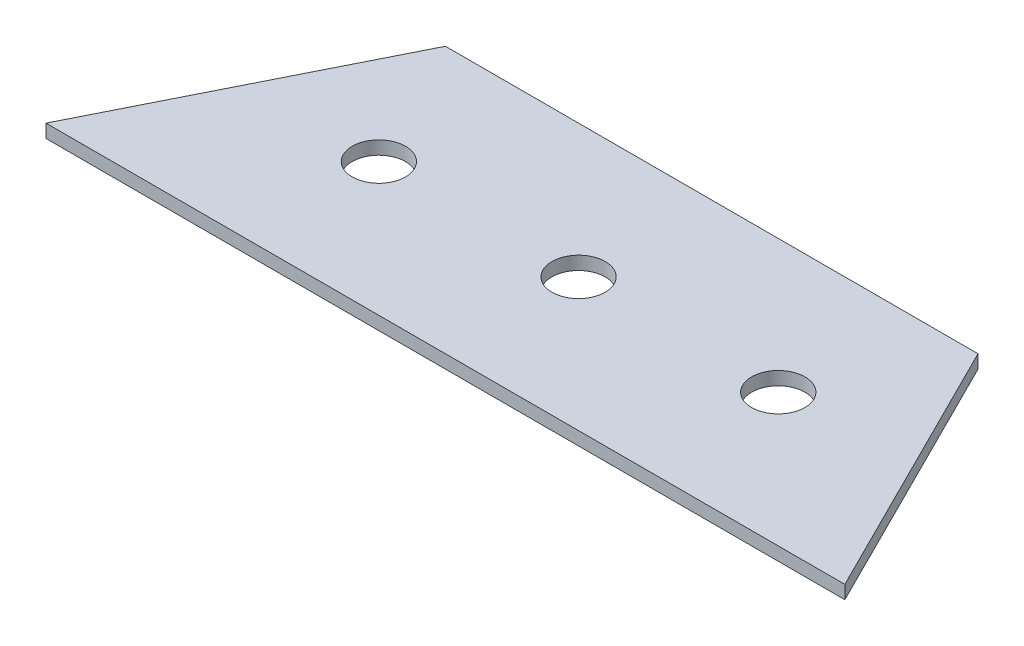
ISO-10303-21;
HEADER;
FILE_DESCRIPTION(('STEP AP214'),'2;1');
FILE_NAME('part.step','',(''),(''),'','','');
FILE_SCHEMA(('AUTOMOTIVE_DESIGN { 1 0 10303 214 1 1 1 1 }'));
ENDSEC;
DATA;
#1=APPLICATION_CONTEXT('core data for automotive mechanical design processes');
#2=APPLICATION_PROTOCOL_DEFINITION('international standard','automotive_design',2000,#1);
#3=PRODUCT_CONTEXT('',#1,'mechanical');
#4=PRODUCT('Part','Part','',(#3));
#5=PRODUCT_RELATED_PRODUCT_CATEGORY('part','',(#4));
#6=PRODUCT_DEFINITION_FORMATION('','',#4);
#7=PRODUCT_DEFINITION_CONTEXT('part definition',#1,'design');
#8=PRODUCT_DEFINITION('design','',#6,#7);
#9=PRODUCT_DEFINITION_SHAPE('','',#8);
#10=(LENGTH_UNIT() NAMED_UNIT(*) SI_UNIT(.MILLI.,.METRE.));
#11=(NAMED_UNIT(*) PLANE_ANGLE_UNIT() SI_UNIT($,.RADIAN.));
#12=(NAMED_UNIT(*) SI_UNIT($,.STERADIAN.) SOLID_ANGLE_UNIT());
#13=UNCERTAINTY_MEASURE_WITH_UNIT(LENGTH_MEASURE(1.E-05),#10,'distance_accuracy_value','');
#14=(GEOMETRIC_REPRESENTATION_CONTEXT(3) GLOBAL_UNCERTAINTY_ASSIGNED_CONTEXT((#13)) GLOBAL_UNIT_ASSIGNED_CONTEXT((#10,
#11,#12)) REPRESENTATION_CONTEXT('',''));
#15=CARTESIAN_POINT('',(0.,0.,0.));
#16=DIRECTION('',(0.,0.,1.));
#17=DIRECTION('',(1.,0.,0.));
#18=AXIS2_PLACEMENT_3D('',#15,#16,#17);
#19=CARTESIAN_POINT('',(-25.4,2.54,-50.8));
#20=DIRECTION('',(-0.894427190999916,0.,0.447213595499958));
#21=DIRECTION('',(0.447213595499958,0.,0.894427190999916));
#22=AXIS2_PLACEMENT_3D('',#19,#20,#21);
#23=PLANE('',#22);
#24=DIRECTION('',(-0.447213595499958,0.,-0.894427190999916));
#25=VECTOR('',#24,1.);
#26=CARTESIAN_POINT('',(-25.4,0.,-50.8));
#27=LINE('',#26,#25);
#28=CARTESIAN_POINT('',(0.,0.,0.));
#29=VERTEX_POINT('',#28);
#30=CARTESIAN_POINT('',(-25.4,0.,-50.8));
#31=VERTEX_POINT('',#30);
#32=EDGE_CURVE('E96',#29,#31,#27,.T.);
#33=ORIENTED_EDGE('',*,*,#32,.T.);
#34=DIRECTION('',(0.,-1.,0.));
#35=VECTOR('',#34,1.);
#36=CARTESIAN_POINT('',(-25.4,2.54,-50.8));
#37=LINE('',#36,#35);
#38=CARTESIAN_POINT('',(-25.4,2.54,-50.8));
#39=VERTEX_POINT('',#38);
#40=EDGE_CURVE('E11',#39,#31,#37,.T.);
#41=ORIENTED_EDGE('',*,*,#40,.F.);
#42=DIRECTION('',(-0.447213595499958,0.,-0.894427190999916));
#43=VECTOR('',#42,1.);
#44=CARTESIAN_POINT('',(-25.4,2.54,-50.8));
#45=LINE('',#44,#43);
#46=CARTESIAN_POINT('',(0.,2.54,0.));
#47=VERTEX_POINT('',#46);
#48=EDGE_CURVE('E84',#47,#39,#45,.T.);
#49=ORIENTED_EDGE('',*,*,#48,.F.);
#50=DIRECTION('',(0.,-1.,0.));
#51=VECTOR('',#50,1.);
#52=CARTESIAN_POINT('',(0.,2.54,0.));
#53=LINE('',#52,#51);
#54=EDGE_CURVE('E92',#47,#29,#53,.T.);
#55=ORIENTED_EDGE('',*,*,#54,.T.);
#56=EDGE_LOOP('',(#33,#41,#49,#55));
#57=FACE_BOUND('',#56,.T.);
#58=ADVANCED_FACE('F33',(#57),#23,.F.);
#59=CARTESIAN_POINT('',(-127.,2.54,-50.8));
#60=DIRECTION('',(0.,0.,1.));
#61=DIRECTION('',(1.,0.,0.));
#62=AXIS2_PLACEMENT_3D('',#59,#60,#61);
#63=PLANE('',#62);
#64=DIRECTION('',(-1.,0.,0.));
#65=VECTOR('',#64,1.);
#66=CARTESIAN_POINT('',(-127.,0.,-50.8));
#67=LINE('',#66,#65);
#68=CARTESIAN_POINT('',(-127.,0.,-50.8));
#69=VERTEX_POINT('',#68);
#70=EDGE_CURVE('E88',#31,#69,#67,.T.);
#71=ORIENTED_EDGE('',*,*,#70,.T.);
#72=DIRECTION('',(0.,-1.,0.));
#73=VECTOR('',#72,1.);
#74=CARTESIAN_POINT('',(-127.,2.54,-50.8));
#75=LINE('',#74,#73);
#76=CARTESIAN_POINT('',(-127.,2.54,-50.8));
#77=VERTEX_POINT('',#76);
#78=EDGE_CURVE('E41',#77,#69,#75,.T.);
#79=ORIENTED_EDGE('',*,*,#78,.F.);
#80=DIRECTION('',(-1.,0.,0.));
#81=VECTOR('',#80,1.);
#82=CARTESIAN_POINT('',(-127.,2.54,-50.8));
#83=LINE('',#82,#81);
#84=EDGE_CURVE('E79',#39,#77,#83,.T.);
#85=ORIENTED_EDGE('',*,*,#84,.F.);
#86=ORIENTED_EDGE('',*,*,#40,.T.);
#87=EDGE_LOOP('',(#71,#79,#85,#86));
#88=FACE_BOUND('',#87,.T.);
#89=ADVANCED_FACE('F87',(#88),#63,.F.);
#90=CARTESIAN_POINT('',(-152.4,2.54,0.));
#91=DIRECTION('',(0.894427190999916,0.,0.447213595499958));
#92=DIRECTION('',(0.447213595499958,0.,-0.894427190999916));
#93=AXIS2_PLACEMENT_3D('',#90,#91,#92);
#94=PLANE('',#93);
#95=DIRECTION('',(-0.447213595499958,0.,0.894427190999916));
#96=VECTOR('',#95,1.);
#97=CARTESIAN_POINT('',(-152.4,0.,0.));
#98=LINE('',#97,#96);
#99=CARTESIAN_POINT('',(-152.4,0.,0.));
#100=VERTEX_POINT('',#99);
#101=EDGE_CURVE('E66',#69,#100,#98,.T.);
#102=ORIENTED_EDGE('',*,*,#101,.T.);
#103=DIRECTION('',(0.,-1.,0.));
#104=VECTOR('',#103,1.);
#105=CARTESIAN_POINT('',(-152.4,2.54,0.));
#106=LINE('',#105,#104);
#107=CARTESIAN_POINT('',(-152.4,2.54,0.));
#108=VERTEX_POINT('',#107);
#109=EDGE_CURVE('E89',#108,#100,#106,.T.);
#110=ORIENTED_EDGE('',*,*,#109,.F.);
#111=DIRECTION('',(-0.447213595499958,0.,0.894427190999916));
#112=VECTOR('',#111,1.);
#113=CARTESIAN_POINT('',(-152.4,2.54,0.));
#114=LINE('',#113,#112);
#115=EDGE_CURVE('E82',#77,#108,#114,.T.);
#116=ORIENTED_EDGE('',*,*,#115,.F.);
#117=ORIENTED_EDGE('',*,*,#78,.T.);
#118=EDGE_LOOP('',(#102,#110,#116,#117));
#119=FACE_BOUND('',#118,.T.);
#120=ADVANCED_FACE('F90',(#119),#94,.F.);
#121=CARTESIAN_POINT('',(0.,2.54,0.));
#122=DIRECTION('',(0.,0.,-1.));
#123=DIRECTION('',(-1.,0.,0.));
#124=AXIS2_PLACEMENT_3D('',#121,#122,#123);
#125=PLANE('',#124);
#126=DIRECTION('',(1.,0.,0.));
#127=VECTOR('',#126,1.);
#128=CARTESIAN_POINT('',(0.,0.,0.));
#129=LINE('',#128,#127);
#130=EDGE_CURVE('E72',#100,#29,#129,.T.);
#131=ORIENTED_EDGE('',*,*,#130,.T.);
#132=ORIENTED_EDGE('',*,*,#54,.F.);
#133=DIRECTION('',(1.,0.,0.));
#134=VECTOR('',#133,1.);
#135=CARTESIAN_POINT('',(0.,2.54,0.));
#136=LINE('',#135,#134);
#137=EDGE_CURVE('E49',#108,#47,#136,.T.);
#138=ORIENTED_EDGE('',*,*,#137,.F.);
#139=ORIENTED_EDGE('',*,*,#109,.T.);
#140=EDGE_LOOP('',(#131,#132,#138,#139));
#141=FACE_BOUND('',#140,.T.);
#142=ADVANCED_FACE('F104',(#141),#125,.F.);
#143=CARTESIAN_POINT('',(0.,2.54,0.));
#144=DIRECTION('',(0.,-1.,0.));
#145=DIRECTION('',(0.,0.,-1.));
#146=AXIS2_PLACEMENT_3D('',#143,#144,#145);
#147=PLANE('',#146);
#148=CARTESIAN_POINT('',(-38.1,2.54,-25.4));
#149=DIRECTION('',(0.,1.,0.));
#150=DIRECTION('',(0.,0.,1.));
#151=AXIS2_PLACEMENT_3D('',#148,#149,#150);
#152=CIRCLE('',#151,5.08000000000001);
#153=CARTESIAN_POINT('',(-38.1,2.54,-20.32));
#154=VERTEX_POINT('',#153);
#155=EDGE_CURVE('E122',#154,#154,#152,.T.);
#156=ORIENTED_EDGE('',*,*,#155,.F.);
#157=EDGE_LOOP('',(#156));
#158=FACE_BOUND('',#157,.T.);
#159=CARTESIAN_POINT('',(-114.3,2.54,-25.4));
#160=DIRECTION('',(0.,1.,0.));
#161=DIRECTION('',(0.,0.,1.));
#162=AXIS2_PLACEMENT_3D('',#159,#160,#161);
#163=CIRCLE('',#162,5.08);
#164=CARTESIAN_POINT('',(-114.3,2.54,-20.32));
#165=VERTEX_POINT('',#164);
#166=EDGE_CURVE('E116',#165,#165,#163,.T.);
#167=ORIENTED_EDGE('',*,*,#166,.F.);
#168=EDGE_LOOP('',(#167));
#169=FACE_BOUND('',#168,.T.);
#170=CARTESIAN_POINT('',(-76.2,2.54,-25.4));
#171=DIRECTION('',(0.,1.,0.));
#172=DIRECTION('',(0.,0.,1.));
#173=AXIS2_PLACEMENT_3D('',#170,#171,#172);
#174=CIRCLE('',#173,5.08);
#175=CARTESIAN_POINT('',(-76.2,2.54,-20.32));
#176=VERTEX_POINT('',#175);
#177=EDGE_CURVE('E110',#176,#176,#174,.T.);
#178=ORIENTED_EDGE('',*,*,#177,.F.);
#179=EDGE_LOOP('',(#178));
#180=FACE_BOUND('',#179,.T.);
#181=ORIENTED_EDGE('',*,*,#48,.T.);
#182=ORIENTED_EDGE('',*,*,#84,.T.);
#183=ORIENTED_EDGE('',*,*,#115,.T.);
#184=ORIENTED_EDGE('',*,*,#137,.T.);
#185=EDGE_LOOP('',(#181,#182,#183,#184));
#186=FACE_BOUND('',#185,.T.);
#187=ADVANCED_FACE('F80',(#158,#169,#180,#186),#147,.F.);
#188=CARTESIAN_POINT('',(0.,0.,0.));
#189=DIRECTION('',(0.,-1.,0.));
#190=DIRECTION('',(0.,0.,-1.));
#191=AXIS2_PLACEMENT_3D('',#188,#189,#190);
#192=PLANE('',#191);
#193=CARTESIAN_POINT('',(-38.1,0.,-25.4));
#194=DIRECTION('',(0.,1.,0.));
#195=DIRECTION('',(0.,0.,1.));
#196=AXIS2_PLACEMENT_3D('',#193,#194,#195);
#197=CIRCLE('',#196,5.08000000000001);
#198=CARTESIAN_POINT('',(-38.1,0.,-20.32));
#199=VERTEX_POINT('',#198);
#200=EDGE_CURVE('E119',#199,#199,#197,.T.);
#201=ORIENTED_EDGE('',*,*,#200,.T.);
#202=EDGE_LOOP('',(#201));
#203=FACE_BOUND('',#202,.T.);
#204=CARTESIAN_POINT('',(-114.3,0.,-25.4));
#205=DIRECTION('',(0.,1.,0.));
#206=DIRECTION('',(0.,0.,1.));
#207=AXIS2_PLACEMENT_3D('',#204,#205,#206);
#208=CIRCLE('',#207,5.08);
#209=CARTESIAN_POINT('',(-114.3,0.,-20.32));
#210=VERTEX_POINT('',#209);
#211=EDGE_CURVE('E113',#210,#210,#208,.T.);
#212=ORIENTED_EDGE('',*,*,#211,.T.);
#213=EDGE_LOOP('',(#212));
#214=FACE_BOUND('',#213,.T.);
#215=CARTESIAN_POINT('',(-76.2,0.,-25.4));
#216=DIRECTION('',(0.,1.,0.));
#217=DIRECTION('',(0.,0.,1.));
#218=AXIS2_PLACEMENT_3D('',#215,#216,#217);
#219=CIRCLE('',#218,5.08);
#220=CARTESIAN_POINT('',(-76.2,0.,-20.32));
#221=VERTEX_POINT('',#220);
#222=EDGE_CURVE('E99',#221,#221,#219,.T.);
#223=ORIENTED_EDGE('',*,*,#222,.T.);
#224=EDGE_LOOP('',(#223));
#225=FACE_BOUND('',#224,.T.);
#226=ORIENTED_EDGE('',*,*,#32,.F.);
#227=ORIENTED_EDGE('',*,*,#130,.F.);
#228=ORIENTED_EDGE('',*,*,#101,.F.);
#229=ORIENTED_EDGE('',*,*,#70,.F.);
#230=EDGE_LOOP('',(#226,#227,#228,#229));
#231=FACE_BOUND('',#230,.T.);
#232=ADVANCED_FACE('F107',(#203,#214,#225,#231),#192,.T.);
#233=CARTESIAN_POINT('',(-76.2,0.,-25.4));
#234=DIRECTION('',(0.,1.,0.));
#235=DIRECTION('',(0.,0.,1.));
#236=AXIS2_PLACEMENT_3D('',#233,#234,#235);
#237=CYLINDRICAL_SURFACE('',#236,5.08);
#238=ORIENTED_EDGE('',*,*,#222,.F.);
#239=EDGE_LOOP('',(#238));
#240=FACE_BOUND('',#239,.T.);
#241=ORIENTED_EDGE('',*,*,#177,.T.);
#242=EDGE_LOOP('',(#241));
#243=FACE_BOUND('',#242,.T.);
#244=ADVANCED_FACE('F144',(#240,#243),#237,.F.);
#245=CARTESIAN_POINT('',(-114.3,0.,-25.4));
#246=DIRECTION('',(0.,1.,0.));
#247=DIRECTION('',(0.,0.,1.));
#248=AXIS2_PLACEMENT_3D('',#245,#246,#247);
#249=CYLINDRICAL_SURFACE('',#248,5.08);
#250=ORIENTED_EDGE('',*,*,#211,.F.);
#251=EDGE_LOOP('',(#250));
#252=FACE_BOUND('',#251,.T.);
#253=ORIENTED_EDGE('',*,*,#166,.T.);
#254=EDGE_LOOP('',(#253));
#255=FACE_BOUND('',#254,.T.);
#256=ADVANCED_FACE('F133',(#252,#255),#249,.F.);
#257=CARTESIAN_POINT('',(-38.1,0.,-25.4));
#258=DIRECTION('',(0.,1.,0.));
#259=DIRECTION('',(0.,0.,1.));
#260=AXIS2_PLACEMENT_3D('',#257,#258,#259);
#261=CYLINDRICAL_SURFACE('',#260,5.08000000000001);
#262=ORIENTED_EDGE('',*,*,#200,.F.);
#263=EDGE_LOOP('',(#262));
#264=FACE_BOUND('',#263,.T.);
#265=ORIENTED_EDGE('',*,*,#155,.T.);
#266=EDGE_LOOP('',(#265));
#267=FACE_BOUND('',#266,.T.);
#268=ADVANCED_FACE('F130',(#264,#267),#261,.F.);
#269=CLOSED_SHELL('',(#58,#89,#120,#142,#187,#232,#244,#256,#268));
#270=MANIFOLD_SOLID_BREP('B2',#269);
#271=ADVANCED_BREP_SHAPE_REPRESENTATION('',(#18,#270),#14);
#272=SHAPE_DEFINITION_REPRESENTATION(#9,#271);
ENDSEC;
END-ISO-10303-21;
